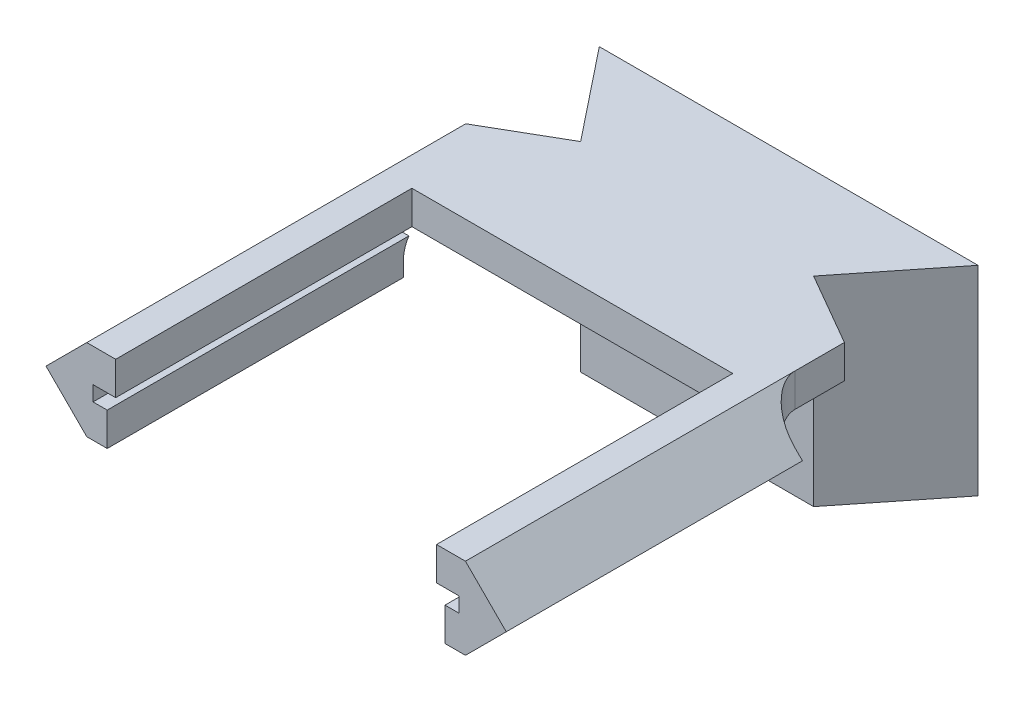
ISO-10303-21;
HEADER;
FILE_DESCRIPTION(('STEP AP214'),'2;1');
FILE_NAME('part.step','',(''),(''),'','','');
FILE_SCHEMA(('AUTOMOTIVE_DESIGN { 1 0 10303 214 1 1 1 1 }'));
ENDSEC;
DATA;
#1=APPLICATION_CONTEXT('core data for automotive mechanical design processes');
#2=APPLICATION_PROTOCOL_DEFINITION('international standard','automotive_design',2000,#1);
#3=PRODUCT_CONTEXT('',#1,'mechanical');
#4=PRODUCT('Part','Part','',(#3));
#5=PRODUCT_RELATED_PRODUCT_CATEGORY('part','',(#4));
#6=PRODUCT_DEFINITION_FORMATION('','',#4);
#7=PRODUCT_DEFINITION_CONTEXT('part definition',#1,'design');
#8=PRODUCT_DEFINITION('design','',#6,#7);
#9=PRODUCT_DEFINITION_SHAPE('','',#8);
#10=(LENGTH_UNIT() NAMED_UNIT(*) SI_UNIT(.MILLI.,.METRE.));
#11=(NAMED_UNIT(*) PLANE_ANGLE_UNIT() SI_UNIT($,.RADIAN.));
#12=(NAMED_UNIT(*) SI_UNIT($,.STERADIAN.) SOLID_ANGLE_UNIT());
#13=UNCERTAINTY_MEASURE_WITH_UNIT(LENGTH_MEASURE(1.E-05),#10,'distance_accuracy_value','');
#14=(GEOMETRIC_REPRESENTATION_CONTEXT(3) GLOBAL_UNCERTAINTY_ASSIGNED_CONTEXT((#13)) GLOBAL_UNIT_ASSIGNED_CONTEXT((#10,
#11,#12)) REPRESENTATION_CONTEXT('',''));
#15=CARTESIAN_POINT('',(0.,0.,0.));
#16=DIRECTION('',(0.,0.,1.));
#17=DIRECTION('',(1.,0.,0.));
#18=AXIS2_PLACEMENT_3D('',#15,#16,#17);
#19=CARTESIAN_POINT('',(0.,1.143,22.606));
#20=DIRECTION('',(0.,-1.,0.));
#21=DIRECTION('',(0.,0.,-1.));
#22=AXIS2_PLACEMENT_3D('',#19,#20,#21);
#23=PLANE('',#22);
#24=DIRECTION('',(-0.866025403784442,0.,0.499999999999995));
#25=VECTOR('',#24,1.);
#26=CARTESIAN_POINT('',(-2.99732098552339,1.143,-5.19151223351899));
#27=LINE('',#26,#25);
#28=CARTESIAN_POINT('',(4.5085,1.143,-9.525));
#29=VERTEX_POINT('',#28);
#30=CARTESIAN_POINT('',(-1.05210244842766,1.143,-6.31458467954385));
#31=VERTEX_POINT('',#30);
#32=EDGE_CURVE('E50',#29,#31,#27,.T.);
#33=ORIENTED_EDGE('',*,*,#32,.F.);
#34=DIRECTION('',(-1.,0.,0.));
#35=VECTOR('',#34,1.);
#36=CARTESIAN_POINT('',(4.5085,1.143,-9.525));
#37=LINE('',#36,#35);
#38=CARTESIAN_POINT('',(22.2885,1.143,-9.525));
#39=VERTEX_POINT('',#38);
#40=EDGE_CURVE('E259',#39,#29,#37,.T.);
#41=ORIENTED_EDGE('',*,*,#40,.F.);
#42=DIRECTION('',(0.866025403784442,0.,0.499999999999995));
#43=VECTOR('',#42,1.);
#44=CARTESIAN_POINT('',(9.69657098552326,1.143,-16.7949536061247));
#45=LINE('',#44,#43);
#46=CARTESIAN_POINT('',(27.8491024484277,1.143,-6.31458467954384));
#47=VERTEX_POINT('',#46);
#48=EDGE_CURVE('E265',#39,#47,#45,.T.);
#49=ORIENTED_EDGE('',*,*,#48,.T.);
#50=DIRECTION('',(0.,0.,-1.));
#51=VECTOR('',#50,1.);
#52=CARTESIAN_POINT('',(27.8491024484277,1.143,4.75232913948519));
#53=LINE('',#52,#51);
#54=CARTESIAN_POINT('',(27.8491024484277,1.143,-2.54));
#55=VERTEX_POINT('',#54);
#56=EDGE_CURVE('E292',#55,#47,#53,.T.);
#57=ORIENTED_EDGE('',*,*,#56,.F.);
#58=DIRECTION('',(-1.,0.,0.));
#59=VECTOR('',#58,1.);
#60=CARTESIAN_POINT('',(27.3685,1.143,-2.54));
#61=LINE('',#60,#59);
#62=CARTESIAN_POINT('',(27.3685,1.143,-2.53999999999999));
#63=VERTEX_POINT('',#62);
#64=EDGE_CURVE('E423',#55,#63,#61,.T.);
#65=ORIENTED_EDGE('',*,*,#64,.T.);
#66=DIRECTION('',(0.,0.,-1.));
#67=VECTOR('',#66,1.);
#68=CARTESIAN_POINT('',(27.3685,1.143,22.606));
#69=LINE('',#68,#67);
#70=CARTESIAN_POINT('',(27.3685,1.143,22.606));
#71=VERTEX_POINT('',#70);
#72=EDGE_CURVE('E374',#71,#63,#69,.T.);
#73=ORIENTED_EDGE('',*,*,#72,.F.);
#74=DIRECTION('',(-1.,0.,0.));
#75=VECTOR('',#74,1.);
#76=CARTESIAN_POINT('',(26.797,1.143,22.606));
#77=LINE('',#76,#75);
#78=CARTESIAN_POINT('',(25.6413,1.143,22.606));
#79=VERTEX_POINT('',#78);
#80=EDGE_CURVE('E365',#71,#79,#77,.T.);
#81=ORIENTED_EDGE('',*,*,#80,.T.);
#82=DIRECTION('',(0.,0.,-1.));
#83=VECTOR('',#82,1.);
#84=CARTESIAN_POINT('',(25.6413,1.143,22.606));
#85=LINE('',#84,#83);
#86=CARTESIAN_POINT('',(25.6413,1.143,0.));
#87=VERTEX_POINT('',#86);
#88=EDGE_CURVE('E314',#79,#87,#85,.T.);
#89=ORIENTED_EDGE('',*,*,#88,.T.);
#90=DIRECTION('',(-1.,0.,0.));
#91=VECTOR('',#90,1.);
#92=CARTESIAN_POINT('',(25.6413,1.143,0.));
#93=LINE('',#92,#91);
#94=CARTESIAN_POINT('',(1.1557,1.143,0.));
#95=VERTEX_POINT('',#94);
#96=EDGE_CURVE('E318',#87,#95,#93,.T.);
#97=ORIENTED_EDGE('',*,*,#96,.T.);
#98=DIRECTION('',(0.,0.,1.));
#99=VECTOR('',#98,1.);
#100=CARTESIAN_POINT('',(1.1557,1.143,0.));
#101=LINE('',#100,#99);
#102=CARTESIAN_POINT('',(1.1557,1.143,22.606));
#103=VERTEX_POINT('',#102);
#104=EDGE_CURVE('E311',#95,#103,#101,.T.);
#105=ORIENTED_EDGE('',*,*,#104,.T.);
#106=CARTESIAN_POINT('',(-0.571500000000003,1.143,22.606));
#107=VERTEX_POINT('',#106);
#108=EDGE_CURVE('E364',#103,#107,#77,.T.);
#109=ORIENTED_EDGE('',*,*,#108,.T.);
#110=DIRECTION('',(0.,0.,-1.));
#111=VECTOR('',#110,1.);
#112=CARTESIAN_POINT('',(-0.571500000000003,1.143,22.606));
#113=LINE('',#112,#111);
#114=CARTESIAN_POINT('',(-0.571500000000003,1.143,-2.53999999999999));
#115=VERTEX_POINT('',#114);
#116=EDGE_CURVE('E372',#107,#115,#113,.T.);
#117=ORIENTED_EDGE('',*,*,#116,.T.);
#118=DIRECTION('',(-1.,0.,0.));
#119=VECTOR('',#118,1.);
#120=CARTESIAN_POINT('',(-1.05210244842766,1.143,-2.54));
#121=LINE('',#120,#119);
#122=CARTESIAN_POINT('',(-1.05210244842766,1.143,-2.54));
#123=VERTEX_POINT('',#122);
#124=EDGE_CURVE('E426',#115,#123,#121,.T.);
#125=ORIENTED_EDGE('',*,*,#124,.T.);
#126=DIRECTION('',(0.,0.,-1.));
#127=VECTOR('',#126,1.);
#128=CARTESIAN_POINT('',(-1.05210244842766,1.143,4.75232913948519));
#129=LINE('',#128,#127);
#130=EDGE_CURVE('E302',#123,#31,#129,.T.);
#131=ORIENTED_EDGE('',*,*,#130,.T.);
#132=EDGE_LOOP('',(#33,#41,#49,#57,#65,#73,#81,#89,#97,#105,#109,#117,#125,#131));
#133=FACE_BOUND('',#132,.T.);
#134=ADVANCED_FACE('F33',(#133),#23,.T.);
#135=CARTESIAN_POINT('',(0.825499999999998,3.683,22.606));
#136=DIRECTION('',(0.,-1.,0.));
#137=DIRECTION('',(1.,0.,0.));
#138=AXIS2_PLACEMENT_3D('',#135,#136,#137);
#139=PLANE('',#138);
#140=DIRECTION('',(1.,0.,0.));
#141=VECTOR('',#140,1.);
#142=CARTESIAN_POINT('',(-1.05210244842766,3.683,-16.51));
#143=LINE('',#142,#141);
#144=CARTESIAN_POINT('',(-1.05210244842766,3.683,-16.51));
#145=VERTEX_POINT('',#144);
#146=CARTESIAN_POINT('',(27.8491024484277,3.68300000000001,-16.51));
#147=VERTEX_POINT('',#146);
#148=EDGE_CURVE('E330',#145,#147,#143,.T.);
#149=ORIENTED_EDGE('',*,*,#148,.F.);
#150=DIRECTION('',(-0.622822097726502,0.,-0.782363492619358));
#151=VECTOR('',#150,1.);
#152=CARTESIAN_POINT('',(7.40089755556073,3.683,-5.89168920086087));
#153=LINE('',#152,#151);
#154=CARTESIAN_POINT('',(4.5085,3.683,-9.525));
#155=VERTEX_POINT('',#154);
#156=EDGE_CURVE('E272',#155,#145,#153,.T.);
#157=ORIENTED_EDGE('',*,*,#156,.F.);
#158=DIRECTION('',(0.866025403784442,0.,-0.499999999999995));
#159=VECTOR('',#158,1.);
#160=CARTESIAN_POINT('',(-2.99732098552338,3.683,-5.191512233519));
#161=LINE('',#160,#159);
#162=CARTESIAN_POINT('',(-1.05210244842766,3.683,-6.31458467954385));
#163=VERTEX_POINT('',#162);
#164=EDGE_CURVE('E274',#163,#155,#161,.T.);
#165=ORIENTED_EDGE('',*,*,#164,.F.);
#166=DIRECTION('',(0.,0.,-1.));
#167=VECTOR('',#166,1.);
#168=CARTESIAN_POINT('',(-1.05210244842766,3.683,4.75232913948519));
#169=LINE('',#168,#167);
#170=CARTESIAN_POINT('',(-1.05210244842766,3.683,-2.53999999999999));
#171=VERTEX_POINT('',#170);
#172=EDGE_CURVE('E305',#171,#163,#169,.T.);
#173=ORIENTED_EDGE('',*,*,#172,.F.);
#174=DIRECTION('',(0.,0.,-1.));
#175=VECTOR('',#174,1.);
#176=CARTESIAN_POINT('',(-1.05210244842766,3.683,22.606));
#177=LINE('',#176,#175);
#178=CARTESIAN_POINT('',(-1.05210244842766,3.683,22.606));
#179=VERTEX_POINT('',#178);
#180=EDGE_CURVE('E410',#179,#171,#177,.T.);
#181=ORIENTED_EDGE('',*,*,#180,.F.);
#182=DIRECTION('',(-1.,0.,0.));
#183=VECTOR('',#182,1.);
#184=CARTESIAN_POINT('',(25.9715,3.683,22.606));
#185=LINE('',#184,#183);
#186=CARTESIAN_POINT('',(1.1557,3.683,22.606));
#187=VERTEX_POINT('',#186);
#188=EDGE_CURVE('E391',#187,#179,#185,.T.);
#189=ORIENTED_EDGE('',*,*,#188,.F.);
#190=DIRECTION('',(0.,0.,1.));
#191=VECTOR('',#190,1.);
#192=CARTESIAN_POINT('',(1.1557,3.683,0.));
#193=LINE('',#192,#191);
#194=CARTESIAN_POINT('',(1.1557,3.683,0.));
#195=VERTEX_POINT('',#194);
#196=EDGE_CURVE('E300',#195,#187,#193,.T.);
#197=ORIENTED_EDGE('',*,*,#196,.F.);
#198=DIRECTION('',(-1.,0.,0.));
#199=VECTOR('',#198,1.);
#200=CARTESIAN_POINT('',(2.9845,3.683,0.));
#201=LINE('',#200,#199);
#202=CARTESIAN_POINT('',(25.6413,3.683,0.));
#203=VERTEX_POINT('',#202);
#204=EDGE_CURVE('E315',#203,#195,#201,.T.);
#205=ORIENTED_EDGE('',*,*,#204,.F.);
#206=DIRECTION('',(0.,0.,-1.));
#207=VECTOR('',#206,1.);
#208=CARTESIAN_POINT('',(25.6413,3.683,22.606));
#209=LINE('',#208,#207);
#210=CARTESIAN_POINT('',(25.6413,3.683,22.606));
#211=VERTEX_POINT('',#210);
#212=EDGE_CURVE('E323',#211,#203,#209,.T.);
#213=ORIENTED_EDGE('',*,*,#212,.F.);
#214=CARTESIAN_POINT('',(27.8491024484277,3.683,22.606));
#215=VERTEX_POINT('',#214);
#216=EDGE_CURVE('E392',#215,#211,#185,.T.);
#217=ORIENTED_EDGE('',*,*,#216,.F.);
#218=DIRECTION('',(0.,0.,-1.));
#219=VECTOR('',#218,1.);
#220=CARTESIAN_POINT('',(27.8491024484277,3.683,22.606));
#221=LINE('',#220,#219);
#222=CARTESIAN_POINT('',(27.8491024484277,3.683,-2.54));
#223=VERTEX_POINT('',#222);
#224=EDGE_CURVE('E412',#215,#223,#221,.T.);
#225=ORIENTED_EDGE('',*,*,#224,.T.);
#226=DIRECTION('',(0.,0.,-1.));
#227=VECTOR('',#226,1.);
#228=CARTESIAN_POINT('',(27.8491024484277,3.683,4.75232913948519));
#229=LINE('',#228,#227);
#230=CARTESIAN_POINT('',(27.8491024484277,3.683,-6.31458467954384));
#231=VERTEX_POINT('',#230);
#232=EDGE_CURVE('E290',#223,#231,#229,.T.);
#233=ORIENTED_EDGE('',*,*,#232,.T.);
#234=DIRECTION('',(-0.866025403784442,0.,-0.499999999999995));
#235=VECTOR('',#234,1.);
#236=CARTESIAN_POINT('',(9.69657098552326,3.683,-16.7949536061247));
#237=LINE('',#236,#235);
#238=CARTESIAN_POINT('',(22.2885,3.68300000000001,-9.525));
#239=VERTEX_POINT('',#238);
#240=EDGE_CURVE('E58',#231,#239,#237,.T.);
#241=ORIENTED_EDGE('',*,*,#240,.T.);
#242=DIRECTION('',(0.622822097726502,0.,-0.782363492619358));
#243=VECTOR('',#242,1.);
#244=CARTESIAN_POINT('',(9.00134877337494,3.683,7.16577265975375));
#245=LINE('',#244,#243);
#246=EDGE_CURVE('E281',#239,#147,#245,.T.);
#247=ORIENTED_EDGE('',*,*,#246,.T.);
#248=EDGE_LOOP('',(#149,#157,#165,#173,#181,#189,#197,#205,#213,#217,#225,#233,#241,#247));
#249=FACE_BOUND('',#248,.T.);
#250=ADVANCED_FACE('F531',(#249),#139,.F.);
#251=CARTESIAN_POINT('',(27.8491024484277,1.143,4.75232913948519));
#252=DIRECTION('',(-1.,0.,0.));
#253=DIRECTION('',(0.,-1.,0.));
#254=AXIS2_PLACEMENT_3D('',#251,#252,#253);
#255=PLANE('',#254);
#256=DIRECTION('',(0.,-1.,0.));
#257=VECTOR('',#256,1.);
#258=CARTESIAN_POINT('',(27.8491024484277,15.2962163135822,-6.31458467954384));
#259=LINE('',#258,#257);
#260=EDGE_CURVE('E283',#231,#47,#259,.T.);
#261=ORIENTED_EDGE('',*,*,#260,.F.);
#262=ORIENTED_EDGE('',*,*,#232,.F.);
#263=DIRECTION('',(0.,-1.,0.));
#264=VECTOR('',#263,1.);
#265=CARTESIAN_POINT('',(27.8491024484277,1.143,-2.54));
#266=LINE('',#265,#264);
#267=EDGE_CURVE('E440',#223,#55,#266,.T.);
#268=ORIENTED_EDGE('',*,*,#267,.T.);
#269=ORIENTED_EDGE('',*,*,#56,.T.);
#270=EDGE_LOOP('',(#261,#262,#268,#269));
#271=FACE_BOUND('',#270,.T.);
#272=ADVANCED_FACE('F525',(#271),#255,.F.);
#273=CARTESIAN_POINT('',(0.,0.,0.));
#274=DIRECTION('',(0.,0.,-1.));
#275=DIRECTION('',(-1.,0.,0.));
#276=AXIS2_PLACEMENT_3D('',#273,#274,#275);
#277=PLANE('',#276);
#278=DIRECTION('',(0.,1.,0.));
#279=VECTOR('',#278,1.);
#280=CARTESIAN_POINT('',(26.289,0.,0.));
#281=LINE('',#280,#279);
#282=CARTESIAN_POINT('',(26.289,-2.54,0.));
#283=VERTEX_POINT('',#282);
#284=CARTESIAN_POINT('',(26.289,-1.397,0.));
#285=VERTEX_POINT('',#284);
#286=EDGE_CURVE('E342',#283,#285,#281,.T.);
#287=ORIENTED_EDGE('',*,*,#286,.T.);
#288=DIRECTION('',(-1.,0.,0.));
#289=VECTOR('',#288,1.);
#290=CARTESIAN_POINT('',(27.8491024484277,-1.397,0.));
#291=LINE('',#290,#289);
#292=CARTESIAN_POINT('',(28.9921024484277,-1.397,0.));
#293=VERTEX_POINT('',#292);
#294=EDGE_CURVE('E438',#285,#293,#291,.F.);
#295=ORIENTED_EDGE('',*,*,#294,.T.);
#296=DIRECTION('',(0.707106781186547,0.707106781186548,0.));
#297=VECTOR('',#296,1.);
#298=CARTESIAN_POINT('',(27.8491024484277,-2.54,0.));
#299=LINE('',#298,#297);
#300=CARTESIAN_POINT('',(27.8491024484277,-2.54,0.));
#301=VERTEX_POINT('',#300);
#302=EDGE_CURVE('E383',#301,#293,#299,.T.);
#303=ORIENTED_EDGE('',*,*,#302,.F.);
#304=DIRECTION('',(1.,0.,0.));
#305=VECTOR('',#304,1.);
#306=CARTESIAN_POINT('',(25.9715,-2.54,0.));
#307=LINE('',#306,#305);
#308=EDGE_CURVE('E401',#283,#301,#307,.T.);
#309=ORIENTED_EDGE('',*,*,#308,.F.);
#310=EDGE_LOOP('',(#287,#295,#303,#309));
#311=FACE_BOUND('',#310,.T.);
#312=ADVANCED_FACE('F509',(#311),#277,.T.);
#313=DIRECTION('',(0.707106781186548,-0.707106781186547,0.));
#314=VECTOR('',#313,1.);
#315=CARTESIAN_POINT('',(-1.05210244842766,-2.54,0.));
#316=LINE('',#315,#314);
#317=CARTESIAN_POINT('',(-2.19510244842766,-1.397,0.));
#318=VERTEX_POINT('',#317);
#319=CARTESIAN_POINT('',(-1.05210244842766,-2.54,0.));
#320=VERTEX_POINT('',#319);
#321=EDGE_CURVE('E378',#318,#320,#316,.T.);
#322=ORIENTED_EDGE('',*,*,#321,.F.);
#323=DIRECTION('',(-1.,0.,0.));
#324=VECTOR('',#323,1.);
#325=CARTESIAN_POINT('',(-0.571500000000003,-1.397,0.));
#326=LINE('',#325,#324);
#327=CARTESIAN_POINT('',(0.507999999999999,-1.397,0.));
#328=VERTEX_POINT('',#327);
#329=EDGE_CURVE('E431',#318,#328,#326,.F.);
#330=ORIENTED_EDGE('',*,*,#329,.T.);
#331=DIRECTION('',(0.,-1.,0.));
#332=VECTOR('',#331,1.);
#333=CARTESIAN_POINT('',(0.508,0.,0.));
#334=LINE('',#333,#332);
#335=CARTESIAN_POINT('',(0.507999999999998,-2.54,0.));
#336=VERTEX_POINT('',#335);
#337=EDGE_CURVE('E340',#328,#336,#334,.T.);
#338=ORIENTED_EDGE('',*,*,#337,.T.);
#339=EDGE_CURVE('E402',#320,#336,#307,.T.);
#340=ORIENTED_EDGE('',*,*,#339,.F.);
#341=EDGE_LOOP('',(#322,#330,#338,#340));
#342=FACE_BOUND('',#341,.T.);
#343=ADVANCED_FACE('F630',(#342),#277,.T.);
#344=CARTESIAN_POINT('',(30.9606024484277,0.571499999999999,22.606));
#345=DIRECTION('',(-0.707106781186548,-0.707106781186547,0.));
#346=DIRECTION('',(0.707106781186547,-0.707106781186548,0.));
#347=AXIS2_PLACEMENT_3D('',#344,#345,#346);
#348=PLANE('',#347);
#349=DIRECTION('',(-0.707106781186547,0.707106781186548,0.));
#350=VECTOR('',#349,1.);
#351=CARTESIAN_POINT('',(27.8491024484277,3.683,0.));
#352=LINE('',#351,#350);
#353=CARTESIAN_POINT('',(30.9606024484277,0.571499999999999,0.));
#354=VERTEX_POINT('',#353);
#355=CARTESIAN_POINT('',(30.3891024484277,1.143,0.));
#356=VERTEX_POINT('',#355);
#357=EDGE_CURVE('E295',#354,#356,#352,.T.);
#358=ORIENTED_EDGE('',*,*,#357,.T.);
#359=CARTESIAN_POINT('',(30.3891024484277,1.143,-2.54));
#360=DIRECTION('',(-0.707106781186548,-0.707106781186547,0.));
#361=DIRECTION('',(0.707106781186547,-0.707106781186548,0.));
#362=AXIS2_PLACEMENT_3D('',#359,#360,#361);
#363=ELLIPSE('',#362,3.59210244842766,2.54);
#364=EDGE_CURVE('E12',#356,#223,#363,.T.);
#365=ORIENTED_EDGE('',*,*,#364,.T.);
#366=ORIENTED_EDGE('',*,*,#224,.F.);
#367=DIRECTION('',(-0.707106781186547,0.707106781186548,0.));
#368=VECTOR('',#367,1.);
#369=CARTESIAN_POINT('',(30.9606024484277,0.571499999999999,22.606));
#370=LINE('',#369,#368);
#371=CARTESIAN_POINT('',(30.9606024484277,0.571499999999999,22.606));
#372=VERTEX_POINT('',#371);
#373=EDGE_CURVE('E389',#372,#215,#370,.T.);
#374=ORIENTED_EDGE('',*,*,#373,.F.);
#375=DIRECTION('',(0.,0.,-1.));
#376=VECTOR('',#375,1.);
#377=CARTESIAN_POINT('',(30.9606024484277,0.571499999999999,22.606));
#378=LINE('',#377,#376);
#379=EDGE_CURVE('E414',#372,#354,#378,.T.);
#380=ORIENTED_EDGE('',*,*,#379,.T.);
#381=EDGE_LOOP('',(#358,#365,#366,#374,#380));
#382=FACE_BOUND('',#381,.T.);
#383=ADVANCED_FACE('F494',(#382),#348,.F.);
#384=CARTESIAN_POINT('',(-4.16360244842766,0.571499999999995,22.606));
#385=DIRECTION('',(0.707106781186548,-0.707106781186547,0.));
#386=DIRECTION('',(0.707106781186547,0.707106781186548,0.));
#387=AXIS2_PLACEMENT_3D('',#384,#385,#386);
#388=PLANE('',#387);
#389=ORIENTED_EDGE('',*,*,#180,.T.);
#390=CARTESIAN_POINT('',(-3.59210244842766,1.143,-2.54));
#391=DIRECTION('',(0.707106781186548,-0.707106781186547,0.));
#392=DIRECTION('',(0.707106781186547,0.707106781186548,0.));
#393=AXIS2_PLACEMENT_3D('',#390,#391,#392);
#394=ELLIPSE('',#393,3.59210244842766,2.54);
#395=CARTESIAN_POINT('',(-3.59210244842766,1.14300000000001,0.));
#396=VERTEX_POINT('',#395);
#397=EDGE_CURVE('E453',#171,#396,#394,.T.);
#398=ORIENTED_EDGE('',*,*,#397,.T.);
#399=DIRECTION('',(-0.707106781186548,-0.707106781186547,0.));
#400=VECTOR('',#399,1.);
#401=CARTESIAN_POINT('',(-1.05210244842766,3.683,0.));
#402=LINE('',#401,#400);
#403=CARTESIAN_POINT('',(-4.16360244842766,0.571499999999999,0.));
#404=VERTEX_POINT('',#403);
#405=EDGE_CURVE('E291',#396,#404,#402,.T.);
#406=ORIENTED_EDGE('',*,*,#405,.T.);
#407=DIRECTION('',(0.,0.,-1.));
#408=VECTOR('',#407,1.);
#409=CARTESIAN_POINT('',(-4.16360244842766,0.571499999999995,22.606));
#410=LINE('',#409,#408);
#411=CARTESIAN_POINT('',(-4.16360244842766,0.571499999999995,22.606));
#412=VERTEX_POINT('',#411);
#413=EDGE_CURVE('E397',#412,#404,#410,.T.);
#414=ORIENTED_EDGE('',*,*,#413,.F.);
#415=DIRECTION('',(-0.707106781186547,-0.707106781186548,0.));
#416=VECTOR('',#415,1.);
#417=CARTESIAN_POINT('',(-4.16360244842766,0.571499999999995,22.606));
#418=LINE('',#417,#416);
#419=EDGE_CURVE('E395',#179,#412,#418,.T.);
#420=ORIENTED_EDGE('',*,*,#419,.F.);
#421=EDGE_LOOP('',(#389,#398,#406,#414,#420));
#422=FACE_BOUND('',#421,.T.);
#423=ADVANCED_FACE('F616',(#422),#388,.F.);
#424=CARTESIAN_POINT('',(27.3685,1.143,22.606));
#425=DIRECTION('',(-1.,0.,0.));
#426=DIRECTION('',(0.,0.,1.));
#427=AXIS2_PLACEMENT_3D('',#424,#425,#426);
#428=PLANE('',#427);
#429=ORIENTED_EDGE('',*,*,#72,.T.);
#430=CARTESIAN_POINT('',(27.3685,-1.397,-2.54));
#431=DIRECTION('',(-1.,0.,0.));
#432=DIRECTION('',(0.,0.,1.));
#433=AXIS2_PLACEMENT_3D('',#430,#431,#432);
#434=CIRCLE('',#433,2.54);
#435=CARTESIAN_POINT('',(27.3685,0.,-0.418681777761751));
#436=VERTEX_POINT('',#435);
#437=EDGE_CURVE('E457',#63,#436,#434,.F.);
#438=ORIENTED_EDGE('',*,*,#437,.T.);
#439=DIRECTION('',(0.,0.,-1.));
#440=VECTOR('',#439,1.);
#441=CARTESIAN_POINT('',(27.3685,0.,22.606));
#442=LINE('',#441,#440);
#443=CARTESIAN_POINT('',(27.3685,0.,22.606));
#444=VERTEX_POINT('',#443);
#445=EDGE_CURVE('E376',#444,#436,#442,.T.);
#446=ORIENTED_EDGE('',*,*,#445,.F.);
#447=DIRECTION('',(0.,1.,0.));
#448=VECTOR('',#447,1.);
#449=CARTESIAN_POINT('',(27.3685,1.143,22.606));
#450=LINE('',#449,#448);
#451=EDGE_CURVE('E362',#444,#71,#450,.T.);
#452=ORIENTED_EDGE('',*,*,#451,.T.);
#453=EDGE_LOOP('',(#429,#438,#446,#452));
#454=FACE_BOUND('',#453,.T.);
#455=ADVANCED_FACE('F519',(#454),#428,.T.);
#456=CARTESIAN_POINT('',(-0.571500000000003,1.143,22.606));
#457=DIRECTION('',(1.,0.,0.));
#458=DIRECTION('',(0.,0.,-1.));
#459=AXIS2_PLACEMENT_3D('',#456,#457,#458);
#460=PLANE('',#459);
#461=DIRECTION('',(0.,0.,-1.));
#462=VECTOR('',#461,1.);
#463=CARTESIAN_POINT('',(-0.571500000000003,0.,22.606));
#464=LINE('',#463,#462);
#465=CARTESIAN_POINT('',(-0.571500000000003,0.,22.606));
#466=VERTEX_POINT('',#465);
#467=CARTESIAN_POINT('',(-0.571500000000003,0.,-0.418681777761751));
#468=VERTEX_POINT('',#467);
#469=EDGE_CURVE('E370',#466,#468,#464,.T.);
#470=ORIENTED_EDGE('',*,*,#469,.T.);
#471=CARTESIAN_POINT('',(-0.571500000000003,-1.397,-2.54));
#472=DIRECTION('',(1.,0.,0.));
#473=DIRECTION('',(0.,0.,-1.));
#474=AXIS2_PLACEMENT_3D('',#471,#472,#473);
#475=CIRCLE('',#474,2.54);
#476=EDGE_CURVE('E450',#468,#115,#475,.F.);
#477=ORIENTED_EDGE('',*,*,#476,.T.);
#478=ORIENTED_EDGE('',*,*,#116,.F.);
#479=DIRECTION('',(0.,-1.,0.));
#480=VECTOR('',#479,1.);
#481=CARTESIAN_POINT('',(-0.571500000000003,1.143,22.606));
#482=LINE('',#481,#480);
#483=EDGE_CURVE('E368',#107,#466,#482,.T.);
#484=ORIENTED_EDGE('',*,*,#483,.T.);
#485=EDGE_LOOP('',(#470,#477,#478,#484));
#486=FACE_BOUND('',#485,.T.);
#487=ADVANCED_FACE('F553',(#486),#460,.T.);
#488=CARTESIAN_POINT('',(0.,0.,22.606));
#489=DIRECTION('',(0.,0.,-1.));
#490=DIRECTION('',(-1.,0.,0.));
#491=AXIS2_PLACEMENT_3D('',#488,#489,#490);
#492=PLANE('',#491);
#493=ORIENTED_EDGE('',*,*,#108,.F.);
#494=DIRECTION('',(0.,1.,0.));
#495=VECTOR('',#494,1.);
#496=CARTESIAN_POINT('',(1.1557,1.143,22.606));
#497=LINE('',#496,#495);
#498=EDGE_CURVE('E321',#103,#187,#497,.T.);
#499=ORIENTED_EDGE('',*,*,#498,.T.);
#500=ORIENTED_EDGE('',*,*,#188,.T.);
#501=ORIENTED_EDGE('',*,*,#419,.T.);
#502=DIRECTION('',(0.707106781186548,-0.707106781186547,0.));
#503=VECTOR('',#502,1.);
#504=CARTESIAN_POINT('',(-1.05210244842766,-2.54,22.606));
#505=LINE('',#504,#503);
#506=CARTESIAN_POINT('',(-1.05210244842766,-2.54,22.606));
#507=VERTEX_POINT('',#506);
#508=EDGE_CURVE('E379',#412,#507,#505,.T.);
#509=ORIENTED_EDGE('',*,*,#508,.T.);
#510=DIRECTION('',(1.,0.,0.));
#511=VECTOR('',#510,1.);
#512=CARTESIAN_POINT('',(0.825500000000002,-2.54,22.606));
#513=LINE('',#512,#511);
#514=CARTESIAN_POINT('',(0.507999999999998,-2.54,22.606));
#515=VERTEX_POINT('',#514);
#516=EDGE_CURVE('E384',#507,#515,#513,.T.);
#517=ORIENTED_EDGE('',*,*,#516,.T.);
#518=DIRECTION('',(0.,-1.,0.));
#519=VECTOR('',#518,1.);
#520=CARTESIAN_POINT('',(0.508,0.,22.606));
#521=LINE('',#520,#519);
#522=CARTESIAN_POINT('',(0.508,0.,22.606));
#523=VERTEX_POINT('',#522);
#524=EDGE_CURVE('E339',#523,#515,#521,.T.);
#525=ORIENTED_EDGE('',*,*,#524,.F.);
#526=DIRECTION('',(1.,0.,0.));
#527=VECTOR('',#526,1.);
#528=CARTESIAN_POINT('',(-0.571500000000003,0.,22.606));
#529=LINE('',#528,#527);
#530=EDGE_CURVE('E359',#466,#523,#529,.T.);
#531=ORIENTED_EDGE('',*,*,#530,.F.);
#532=ORIENTED_EDGE('',*,*,#483,.F.);
#533=EDGE_LOOP('',(#493,#499,#500,#501,#509,#517,#525,#531,#532));
#534=FACE_BOUND('',#533,.T.);
#535=ADVANCED_FACE('F547',(#534),#492,.F.);
#536=ORIENTED_EDGE('',*,*,#405,.F.);
#537=DIRECTION('',(0.,1.,0.));
#538=VECTOR('',#537,1.);
#539=CARTESIAN_POINT('',(-3.59210244842765,0.,0.));
#540=LINE('',#539,#538);
#541=CARTESIAN_POINT('',(-3.59210244842765,0.,0.));
#542=VERTEX_POINT('',#541);
#543=EDGE_CURVE('E429',#396,#542,#540,.F.);
#544=ORIENTED_EDGE('',*,*,#543,.T.);
#545=EDGE_CURVE('E398',#404,#542,#316,.T.);
#546=ORIENTED_EDGE('',*,*,#545,.F.);
#547=EDGE_LOOP('',(#536,#544,#546));
#548=FACE_BOUND('',#547,.T.);
#549=ADVANCED_FACE('F624',(#548),#277,.T.);
#550=CARTESIAN_POINT('',(25.9715,-2.54,22.606));
#551=DIRECTION('',(0.,1.,0.));
#552=DIRECTION('',(0.,0.,1.));
#553=AXIS2_PLACEMENT_3D('',#550,#551,#552);
#554=PLANE('',#553);
#555=ORIENTED_EDGE('',*,*,#339,.T.);
#556=DIRECTION('',(0.,0.,1.));
#557=VECTOR('',#556,1.);
#558=CARTESIAN_POINT('',(0.507999999999998,-2.54,0.));
#559=LINE('',#558,#557);
#560=EDGE_CURVE('E346',#336,#515,#559,.T.);
#561=ORIENTED_EDGE('',*,*,#560,.T.);
#562=ORIENTED_EDGE('',*,*,#516,.F.);
#563=DIRECTION('',(0.,0.,-1.));
#564=VECTOR('',#563,1.);
#565=CARTESIAN_POINT('',(-1.05210244842766,-2.54,22.606));
#566=LINE('',#565,#564);
#567=EDGE_CURVE('E420',#507,#320,#566,.T.);
#568=ORIENTED_EDGE('',*,*,#567,.T.);
#569=EDGE_LOOP('',(#555,#561,#562,#568));
#570=FACE_BOUND('',#569,.T.);
#571=ADVANCED_FACE('F635',(#570),#554,.F.);
#572=CARTESIAN_POINT('',(27.3685,0.,22.606));
#573=DIRECTION('',(0.,1.,0.));
#574=DIRECTION('',(0.,0.,1.));
#575=AXIS2_PLACEMENT_3D('',#572,#573,#574);
#576=PLANE('',#575);
#577=DIRECTION('',(0.,0.,1.));
#578=VECTOR('',#577,1.);
#579=CARTESIAN_POINT('',(0.508,0.,0.));
#580=LINE('',#579,#578);
#581=CARTESIAN_POINT('',(0.508,0.,-0.418681777761759));
#582=VERTEX_POINT('',#581);
#583=EDGE_CURVE('E349',#582,#523,#580,.T.);
#584=ORIENTED_EDGE('',*,*,#583,.F.);
#585=DIRECTION('',(1.,0.,0.));
#586=VECTOR('',#585,1.);
#587=CARTESIAN_POINT('',(0.508,0.,-0.418681777761759));
#588=LINE('',#587,#586);
#589=EDGE_CURVE('E447',#582,#468,#588,.F.);
#590=ORIENTED_EDGE('',*,*,#589,.T.);
#591=ORIENTED_EDGE('',*,*,#469,.F.);
#592=ORIENTED_EDGE('',*,*,#530,.T.);
#593=EDGE_LOOP('',(#584,#590,#591,#592));
#594=FACE_BOUND('',#593,.T.);
#595=ADVANCED_FACE('F555',(#594),#576,.T.);
#596=ORIENTED_EDGE('',*,*,#216,.T.);
#597=DIRECTION('',(0.,1.,0.));
#598=VECTOR('',#597,1.);
#599=CARTESIAN_POINT('',(25.6413,1.143,22.606));
#600=LINE('',#599,#598);
#601=EDGE_CURVE('E333',#79,#211,#600,.T.);
#602=ORIENTED_EDGE('',*,*,#601,.F.);
#603=ORIENTED_EDGE('',*,*,#80,.F.);
#604=ORIENTED_EDGE('',*,*,#451,.F.);
#605=CARTESIAN_POINT('',(26.289,0.,22.606));
#606=VERTEX_POINT('',#605);
#607=EDGE_CURVE('E351',#606,#444,#529,.T.);
#608=ORIENTED_EDGE('',*,*,#607,.F.);
#609=DIRECTION('',(0.,1.,0.));
#610=VECTOR('',#609,1.);
#611=CARTESIAN_POINT('',(26.289,0.,22.606));
#612=LINE('',#611,#610);
#613=CARTESIAN_POINT('',(26.289,-2.54,22.606));
#614=VERTEX_POINT('',#613);
#615=EDGE_CURVE('E343',#614,#606,#612,.T.);
#616=ORIENTED_EDGE('',*,*,#615,.F.);
#617=CARTESIAN_POINT('',(27.8491024484277,-2.54,22.606));
#618=VERTEX_POINT('',#617);
#619=EDGE_CURVE('E382',#614,#618,#513,.T.);
#620=ORIENTED_EDGE('',*,*,#619,.T.);
#621=DIRECTION('',(0.707106781186547,0.707106781186548,0.));
#622=VECTOR('',#621,1.);
#623=CARTESIAN_POINT('',(27.8491024484277,-2.54,22.606));
#624=LINE('',#623,#622);
#625=EDGE_CURVE('E387',#618,#372,#624,.T.);
#626=ORIENTED_EDGE('',*,*,#625,.T.);
#627=ORIENTED_EDGE('',*,*,#373,.T.);
#628=EDGE_LOOP('',(#596,#602,#603,#604,#608,#616,#620,#626,#627));
#629=FACE_BOUND('',#628,.T.);
#630=ADVANCED_FACE('F500',(#629),#492,.F.);
#631=CARTESIAN_POINT('',(30.3891024484277,0.,0.));
#632=VERTEX_POINT('',#631);
#633=EDGE_CURVE('E405',#632,#354,#299,.T.);
#634=ORIENTED_EDGE('',*,*,#633,.F.);
#635=DIRECTION('',(0.,-1.,0.));
#636=VECTOR('',#635,1.);
#637=CARTESIAN_POINT('',(30.3891024484277,0.,0.));
#638=LINE('',#637,#636);
#639=EDGE_CURVE('E436',#632,#356,#638,.F.);
#640=ORIENTED_EDGE('',*,*,#639,.T.);
#641=ORIENTED_EDGE('',*,*,#357,.F.);
#642=EDGE_LOOP('',(#634,#640,#641));
#643=FACE_BOUND('',#642,.T.);
#644=ADVANCED_FACE('F491',(#643),#277,.T.);
#645=CARTESIAN_POINT('',(-1.05210244842766,-2.54,22.606));
#646=DIRECTION('',(0.707106781186547,0.707106781186548,0.));
#647=DIRECTION('',(-0.707106781186548,0.707106781186547,0.));
#648=AXIS2_PLACEMENT_3D('',#645,#646,#647);
#649=PLANE('',#648);
#650=ORIENTED_EDGE('',*,*,#545,.T.);
#651=CARTESIAN_POINT('',(-3.59210244842765,0.,-2.54));
#652=DIRECTION('',(0.707106781186547,0.707106781186548,0.));
#653=DIRECTION('',(-0.707106781186548,0.707106781186547,0.));
#654=AXIS2_PLACEMENT_3D('',#651,#652,#653);
#655=ELLIPSE('',#654,3.59210244842767,2.54);
#656=CARTESIAN_POINT('',(-2.89360244842766,-0.698500000000003,-0.0979316655752645));
#657=VERTEX_POINT('',#656);
#658=EDGE_CURVE('E455',#542,#657,#655,.T.);
#659=ORIENTED_EDGE('',*,*,#658,.T.);
#660=CARTESIAN_POINT('',(-2.19510244842766,-1.397,-2.54));
#661=DIRECTION('',(0.707106781186547,0.707106781186548,0.));
#662=DIRECTION('',(0.707106781186548,-0.707106781186547,0.));
#663=AXIS2_PLACEMENT_3D('',#660,#661,#662);
#664=ELLIPSE('',#663,3.59210244842766,2.54);
#665=EDGE_CURVE('E442',#657,#318,#664,.T.);
#666=ORIENTED_EDGE('',*,*,#665,.T.);
#667=ORIENTED_EDGE('',*,*,#321,.T.);
#668=ORIENTED_EDGE('',*,*,#567,.F.);
#669=ORIENTED_EDGE('',*,*,#508,.F.);
#670=ORIENTED_EDGE('',*,*,#413,.T.);
#671=EDGE_LOOP('',(#650,#659,#666,#667,#668,#669,#670));
#672=FACE_BOUND('',#671,.T.);
#673=ADVANCED_FACE('F623',(#672),#649,.F.);
#674=ORIENTED_EDGE('',*,*,#619,.F.);
#675=DIRECTION('',(0.,0.,1.));
#676=VECTOR('',#675,1.);
#677=CARTESIAN_POINT('',(26.289,-2.54,0.));
#678=LINE('',#677,#676);
#679=EDGE_CURVE('E355',#283,#614,#678,.T.);
#680=ORIENTED_EDGE('',*,*,#679,.F.);
#681=ORIENTED_EDGE('',*,*,#308,.T.);
#682=DIRECTION('',(0.,0.,-1.));
#683=VECTOR('',#682,1.);
#684=CARTESIAN_POINT('',(27.8491024484277,-2.54,22.606));
#685=LINE('',#684,#683);
#686=EDGE_CURVE('E417',#618,#301,#685,.T.);
#687=ORIENTED_EDGE('',*,*,#686,.F.);
#688=EDGE_LOOP('',(#674,#680,#681,#687));
#689=FACE_BOUND('',#688,.T.);
#690=ADVANCED_FACE('F506',(#689),#554,.F.);
#691=CARTESIAN_POINT('',(27.8491024484277,-2.54,22.606));
#692=DIRECTION('',(-0.707106781186548,0.707106781186547,0.));
#693=DIRECTION('',(-0.707106781186547,-0.707106781186548,0.));
#694=AXIS2_PLACEMENT_3D('',#691,#692,#693);
#695=PLANE('',#694);
#696=ORIENTED_EDGE('',*,*,#302,.T.);
#697=CARTESIAN_POINT('',(28.9921024484277,-1.397,-2.54));
#698=DIRECTION('',(-0.707106781186548,0.707106781186547,0.));
#699=DIRECTION('',(0.707106781186547,0.707106781186548,0.));
#700=AXIS2_PLACEMENT_3D('',#697,#698,#699);
#701=ELLIPSE('',#700,3.59210244842766,2.54);
#702=CARTESIAN_POINT('',(29.6906024484277,-0.698500000000004,-0.0979316655752641));
#703=VERTEX_POINT('',#702);
#704=EDGE_CURVE('E465',#293,#703,#701,.T.);
#705=ORIENTED_EDGE('',*,*,#704,.T.);
#706=CARTESIAN_POINT('',(30.3891024484277,0.,-2.54));
#707=DIRECTION('',(-0.707106781186548,0.707106781186547,0.));
#708=DIRECTION('',(-0.707106781186547,-0.707106781186548,0.));
#709=AXIS2_PLACEMENT_3D('',#706,#707,#708);
#710=ELLIPSE('',#709,3.59210244842767,2.54);
#711=EDGE_CURVE('E42',#703,#632,#710,.T.);
#712=ORIENTED_EDGE('',*,*,#711,.T.);
#713=ORIENTED_EDGE('',*,*,#633,.T.);
#714=ORIENTED_EDGE('',*,*,#379,.F.);
#715=ORIENTED_EDGE('',*,*,#625,.F.);
#716=ORIENTED_EDGE('',*,*,#686,.T.);
#717=EDGE_LOOP('',(#696,#705,#712,#713,#714,#715,#716));
#718=FACE_BOUND('',#717,.T.);
#719=ADVANCED_FACE('F487',(#718),#695,.F.);
#720=DIRECTION('',(0.,0.,1.));
#721=VECTOR('',#720,1.);
#722=CARTESIAN_POINT('',(26.289,0.,0.));
#723=LINE('',#722,#721);
#724=CARTESIAN_POINT('',(26.289,0.,-0.418681777761759));
#725=VERTEX_POINT('',#724);
#726=EDGE_CURVE('E352',#725,#606,#723,.T.);
#727=ORIENTED_EDGE('',*,*,#726,.T.);
#728=ORIENTED_EDGE('',*,*,#607,.T.);
#729=ORIENTED_EDGE('',*,*,#445,.T.);
#730=DIRECTION('',(1.,0.,0.));
#731=VECTOR('',#730,1.);
#732=CARTESIAN_POINT('',(27.3685,0.,-0.418681777761759));
#733=LINE('',#732,#731);
#734=EDGE_CURVE('E460',#436,#725,#733,.F.);
#735=ORIENTED_EDGE('',*,*,#734,.T.);
#736=EDGE_LOOP('',(#727,#728,#729,#735));
#737=FACE_BOUND('',#736,.T.);
#738=ADVANCED_FACE('F515',(#737),#576,.T.);
#739=CARTESIAN_POINT('',(26.289,0.,0.));
#740=DIRECTION('',(1.,0.,0.));
#741=DIRECTION('',(0.,0.,-1.));
#742=AXIS2_PLACEMENT_3D('',#739,#740,#741);
#743=PLANE('',#742);
#744=ORIENTED_EDGE('',*,*,#615,.T.);
#745=ORIENTED_EDGE('',*,*,#726,.F.);
#746=CARTESIAN_POINT('',(26.289,-1.397,-2.54));
#747=DIRECTION('',(1.,0.,0.));
#748=DIRECTION('',(0.,0.,-1.));
#749=AXIS2_PLACEMENT_3D('',#746,#747,#748);
#750=CIRCLE('',#749,2.54);
#751=EDGE_CURVE('E463',#725,#285,#750,.T.);
#752=ORIENTED_EDGE('',*,*,#751,.T.);
#753=ORIENTED_EDGE('',*,*,#286,.F.);
#754=ORIENTED_EDGE('',*,*,#679,.T.);
#755=EDGE_LOOP('',(#744,#745,#752,#753,#754));
#756=FACE_BOUND('',#755,.T.);
#757=ADVANCED_FACE('F513',(#756),#743,.F.);
#758=CARTESIAN_POINT('',(0.508,0.,0.));
#759=DIRECTION('',(-1.,0.,0.));
#760=DIRECTION('',(0.,-1.,0.));
#761=AXIS2_PLACEMENT_3D('',#758,#759,#760);
#762=PLANE('',#761);
#763=ORIENTED_EDGE('',*,*,#524,.T.);
#764=ORIENTED_EDGE('',*,*,#560,.F.);
#765=ORIENTED_EDGE('',*,*,#337,.F.);
#766=CARTESIAN_POINT('',(0.507999999999999,-1.397,-2.54));
#767=DIRECTION('',(-1.,0.,0.));
#768=DIRECTION('',(0.,-1.,0.));
#769=AXIS2_PLACEMENT_3D('',#766,#767,#768);
#770=CIRCLE('',#769,2.54);
#771=EDGE_CURVE('E444',#328,#582,#770,.T.);
#772=ORIENTED_EDGE('',*,*,#771,.T.);
#773=ORIENTED_EDGE('',*,*,#583,.T.);
#774=EDGE_LOOP('',(#763,#764,#765,#772,#773));
#775=FACE_BOUND('',#774,.T.);
#776=ADVANCED_FACE('F695',(#775),#762,.F.);
#777=CARTESIAN_POINT('',(0.,0.,-16.51));
#778=DIRECTION('',(0.,0.,1.));
#779=DIRECTION('',(1.,0.,0.));
#780=AXIS2_PLACEMENT_3D('',#777,#778,#779);
#781=PLANE('',#780);
#782=CARTESIAN_POINT('',(18.4785,-3.937,-16.51));
#783=DIRECTION('',(0.,0.,-1.));
#784=DIRECTION('',(-1.,0.,0.));
#785=AXIS2_PLACEMENT_3D('',#782,#783,#784);
#786=CIRCLE('',#785,2.);
#787=CARTESIAN_POINT('',(16.4785,-3.937,-16.51));
#788=VERTEX_POINT('',#787);
#789=EDGE_CURVE('E579',#788,#788,#786,.T.);
#790=ORIENTED_EDGE('',*,*,#789,.F.);
#791=EDGE_LOOP('',(#790));
#792=FACE_BOUND('',#791,.T.);
#793=CARTESIAN_POINT('',(8.3185,-3.937,-16.51));
#794=DIRECTION('',(0.,0.,-1.));
#795=DIRECTION('',(1.,0.,0.));
#796=AXIS2_PLACEMENT_3D('',#793,#794,#795);
#797=CIRCLE('',#796,2.);
#798=CARTESIAN_POINT('',(10.3185,-3.937,-16.51));
#799=VERTEX_POINT('',#798);
#800=EDGE_CURVE('E587',#799,#799,#797,.T.);
#801=ORIENTED_EDGE('',*,*,#800,.F.);
#802=EDGE_LOOP('',(#801));
#803=FACE_BOUND('',#802,.T.);
#804=ORIENTED_EDGE('',*,*,#148,.T.);
#805=DIRECTION('',(0.,1.,0.));
#806=VECTOR('',#805,1.);
#807=CARTESIAN_POINT('',(27.8491024484277,1.143,-16.51));
#808=LINE('',#807,#806);
#809=CARTESIAN_POINT('',(27.8491024484277,-11.557,-16.51));
#810=VERTEX_POINT('',#809);
#811=EDGE_CURVE('E288',#810,#147,#808,.T.);
#812=ORIENTED_EDGE('',*,*,#811,.F.);
#813=DIRECTION('',(1.,0.,0.));
#814=VECTOR('',#813,1.);
#815=CARTESIAN_POINT('',(-1.05210244842766,-11.557,-16.51));
#816=LINE('',#815,#814);
#817=CARTESIAN_POINT('',(-1.05210244842766,-11.557,-16.51));
#818=VERTEX_POINT('',#817);
#819=EDGE_CURVE('E257',#818,#810,#816,.T.);
#820=ORIENTED_EDGE('',*,*,#819,.F.);
#821=DIRECTION('',(0.,-1.,0.));
#822=VECTOR('',#821,1.);
#823=CARTESIAN_POINT('',(-1.05210244842766,1.143,-16.51));
#824=LINE('',#823,#822);
#825=EDGE_CURVE('E303',#145,#818,#824,.T.);
#826=ORIENTED_EDGE('',*,*,#825,.F.);
#827=EDGE_LOOP('',(#804,#812,#820,#826));
#828=FACE_BOUND('',#827,.T.);
#829=ADVANCED_FACE('F574',(#792,#803,#828),#781,.F.);
#830=CARTESIAN_POINT('',(1.1557,1.143,0.));
#831=DIRECTION('',(-1.,0.,0.));
#832=DIRECTION('',(0.,0.,1.));
#833=AXIS2_PLACEMENT_3D('',#830,#831,#832);
#834=PLANE('',#833);
#835=ORIENTED_EDGE('',*,*,#196,.T.);
#836=ORIENTED_EDGE('',*,*,#498,.F.);
#837=ORIENTED_EDGE('',*,*,#104,.F.);
#838=DIRECTION('',(0.,1.,0.));
#839=VECTOR('',#838,1.);
#840=CARTESIAN_POINT('',(1.1557,1.143,0.));
#841=LINE('',#840,#839);
#842=EDGE_CURVE('E328',#95,#195,#841,.T.);
#843=ORIENTED_EDGE('',*,*,#842,.T.);
#844=EDGE_LOOP('',(#835,#836,#837,#843));
#845=FACE_BOUND('',#844,.T.);
#846=ADVANCED_FACE('F542',(#845),#834,.F.);
#847=CARTESIAN_POINT('',(2.9845,1.143,0.));
#848=DIRECTION('',(0.,0.,-1.));
#849=DIRECTION('',(-1.,0.,0.));
#850=AXIS2_PLACEMENT_3D('',#847,#848,#849);
#851=PLANE('',#850);
#852=ORIENTED_EDGE('',*,*,#204,.T.);
#853=ORIENTED_EDGE('',*,*,#842,.F.);
#854=ORIENTED_EDGE('',*,*,#96,.F.);
#855=DIRECTION('',(0.,1.,0.));
#856=VECTOR('',#855,1.);
#857=CARTESIAN_POINT('',(25.6413,1.143,0.));
#858=LINE('',#857,#856);
#859=EDGE_CURVE('E331',#87,#203,#858,.T.);
#860=ORIENTED_EDGE('',*,*,#859,.T.);
#861=EDGE_LOOP('',(#852,#853,#854,#860));
#862=FACE_BOUND('',#861,.T.);
#863=ADVANCED_FACE('F538',(#862),#851,.F.);
#864=CARTESIAN_POINT('',(25.6413,1.143,22.606));
#865=DIRECTION('',(1.,0.,0.));
#866=DIRECTION('',(0.,0.,-1.));
#867=AXIS2_PLACEMENT_3D('',#864,#865,#866);
#868=PLANE('',#867);
#869=ORIENTED_EDGE('',*,*,#212,.T.);
#870=ORIENTED_EDGE('',*,*,#859,.F.);
#871=ORIENTED_EDGE('',*,*,#88,.F.);
#872=ORIENTED_EDGE('',*,*,#601,.T.);
#873=EDGE_LOOP('',(#869,#870,#871,#872));
#874=FACE_BOUND('',#873,.T.);
#875=ADVANCED_FACE('F536',(#874),#868,.F.);
#876=CARTESIAN_POINT('',(-1.05210244842766,1.143,4.75232913948519));
#877=DIRECTION('',(1.,0.,0.));
#878=DIRECTION('',(0.,1.,0.));
#879=AXIS2_PLACEMENT_3D('',#876,#877,#878);
#880=PLANE('',#879);
#881=ORIENTED_EDGE('',*,*,#172,.T.);
#882=DIRECTION('',(0.,-1.,0.));
#883=VECTOR('',#882,1.);
#884=CARTESIAN_POINT('',(-1.05210244842766,15.2962163135822,-6.31458467954385));
#885=LINE('',#884,#883);
#886=EDGE_CURVE('E275',#163,#31,#885,.T.);
#887=ORIENTED_EDGE('',*,*,#886,.T.);
#888=ORIENTED_EDGE('',*,*,#130,.F.);
#889=DIRECTION('',(0.,1.,0.));
#890=VECTOR('',#889,1.);
#891=CARTESIAN_POINT('',(-1.05210244842766,1.143,-2.54));
#892=LINE('',#891,#890);
#893=EDGE_CURVE('E433',#123,#171,#892,.T.);
#894=ORIENTED_EDGE('',*,*,#893,.T.);
#895=EDGE_LOOP('',(#881,#887,#888,#894));
#896=FACE_BOUND('',#895,.T.);
#897=ADVANCED_FACE('F562',(#896),#880,.F.);
#898=CARTESIAN_POINT('',(-3.59210244842766,1.143,-2.54));
#899=DIRECTION('',(0.,1.,0.));
#900=DIRECTION('',(-1.,0.,0.));
#901=AXIS2_PLACEMENT_3D('',#898,#899,#900);
#902=CYLINDRICAL_SURFACE('',#901,2.54);
#903=ORIENTED_EDGE('',*,*,#397,.F.);
#904=ORIENTED_EDGE('',*,*,#893,.F.);
#905=CARTESIAN_POINT('',(-3.59210244842765,-1.397,-2.54));
#906=DIRECTION('',(0.707106781186548,-0.707106781186547,0.));
#907=DIRECTION('',(0.707106781186547,0.707106781186548,0.));
#908=AXIS2_PLACEMENT_3D('',#905,#906,#907);
#909=ELLIPSE('',#908,3.59210244842766,2.54);
#910=EDGE_CURVE('E306',#657,#123,#909,.F.);
#911=ORIENTED_EDGE('',*,*,#910,.F.);
#912=ORIENTED_EDGE('',*,*,#658,.F.);
#913=ORIENTED_EDGE('',*,*,#543,.F.);
#914=EDGE_LOOP('',(#903,#904,#911,#912,#913));
#915=FACE_BOUND('',#914,.T.);
#916=ADVANCED_FACE('F641',(#915),#902,.F.);
#917=CARTESIAN_POINT('',(0.,-1.397,-2.54));
#918=DIRECTION('',(1.,0.,0.));
#919=DIRECTION('',(0.,0.,-1.));
#920=AXIS2_PLACEMENT_3D('',#917,#918,#919);
#921=CYLINDRICAL_SURFACE('',#920,2.54);
#922=ORIENTED_EDGE('',*,*,#771,.F.);
#923=ORIENTED_EDGE('',*,*,#329,.F.);
#924=ORIENTED_EDGE('',*,*,#665,.F.);
#925=ORIENTED_EDGE('',*,*,#910,.T.);
#926=ORIENTED_EDGE('',*,*,#124,.F.);
#927=ORIENTED_EDGE('',*,*,#476,.F.);
#928=ORIENTED_EDGE('',*,*,#589,.F.);
#929=EDGE_LOOP('',(#922,#923,#924,#925,#926,#927,#928));
#930=FACE_BOUND('',#929,.T.);
#931=ADVANCED_FACE('F559',(#930),#921,.F.);
#932=CARTESIAN_POINT('',(30.3891024484277,1.143,-2.54));
#933=DIRECTION('',(0.,-1.,0.));
#934=DIRECTION('',(1.,0.,0.));
#935=AXIS2_PLACEMENT_3D('',#932,#933,#934);
#936=CYLINDRICAL_SURFACE('',#935,2.54);
#937=ORIENTED_EDGE('',*,*,#639,.F.);
#938=ORIENTED_EDGE('',*,*,#711,.F.);
#939=CARTESIAN_POINT('',(30.3891024484276,-1.397,-2.54));
#940=DIRECTION('',(0.707106781186548,0.707106781186547,0.));
#941=DIRECTION('',(0.707106781186547,-0.707106781186548,0.));
#942=AXIS2_PLACEMENT_3D('',#939,#940,#941);
#943=ELLIPSE('',#942,3.59210244842766,2.54);
#944=EDGE_CURVE('E37',#55,#703,#943,.T.);
#945=ORIENTED_EDGE('',*,*,#944,.F.);
#946=ORIENTED_EDGE('',*,*,#267,.F.);
#947=ORIENTED_EDGE('',*,*,#364,.F.);
#948=EDGE_LOOP('',(#937,#938,#945,#946,#947));
#949=FACE_BOUND('',#948,.T.);
#950=ADVANCED_FACE('F35',(#949),#936,.F.);
#951=CARTESIAN_POINT('',(0.,-1.397,-2.54));
#952=DIRECTION('',(1.,0.,0.));
#953=DIRECTION('',(0.,0.,-1.));
#954=AXIS2_PLACEMENT_3D('',#951,#952,#953);
#955=CYLINDRICAL_SURFACE('',#954,2.54);
#956=ORIENTED_EDGE('',*,*,#704,.F.);
#957=ORIENTED_EDGE('',*,*,#294,.F.);
#958=ORIENTED_EDGE('',*,*,#751,.F.);
#959=ORIENTED_EDGE('',*,*,#734,.F.);
#960=ORIENTED_EDGE('',*,*,#437,.F.);
#961=ORIENTED_EDGE('',*,*,#64,.F.);
#962=ORIENTED_EDGE('',*,*,#944,.T.);
#963=EDGE_LOOP('',(#956,#957,#958,#959,#960,#961,#962));
#964=FACE_BOUND('',#963,.T.);
#965=ADVANCED_FACE('F477',(#964),#955,.F.);
#966=CARTESIAN_POINT('',(9.00134877337493,15.2962163135822,7.16577265975375));
#967=DIRECTION('',(0.782363492619358,0.,0.622822097726502));
#968=DIRECTION('',(0.622822097726502,0.,-0.782363492619358));
#969=AXIS2_PLACEMENT_3D('',#966,#967,#968);
#970=PLANE('',#969);
#971=DIRECTION('',(0.,-1.,0.));
#972=VECTOR('',#971,1.);
#973=CARTESIAN_POINT('',(22.2885,15.2962163135822,-9.525));
#974=LINE('',#973,#972);
#975=EDGE_CURVE('E263',#239,#39,#974,.T.);
#976=ORIENTED_EDGE('',*,*,#975,.T.);
#977=DIRECTION('',(0.,1.,0.));
#978=VECTOR('',#977,1.);
#979=CARTESIAN_POINT('',(22.2885,-11.557,-9.525));
#980=LINE('',#979,#978);
#981=CARTESIAN_POINT('',(22.2885,-11.557,-9.525));
#982=VERTEX_POINT('',#981);
#983=EDGE_CURVE('E244',#982,#39,#980,.T.);
#984=ORIENTED_EDGE('',*,*,#983,.F.);
#985=DIRECTION('',(-0.622822097726502,0.,0.782363492619358));
#986=VECTOR('',#985,1.);
#987=CARTESIAN_POINT('',(22.2885,-11.557,-9.525));
#988=LINE('',#987,#986);
#989=EDGE_CURVE('E251',#810,#982,#988,.T.);
#990=ORIENTED_EDGE('',*,*,#989,.F.);
#991=ORIENTED_EDGE('',*,*,#811,.T.);
#992=ORIENTED_EDGE('',*,*,#246,.F.);
#993=EDGE_LOOP('',(#976,#984,#990,#991,#992));
#994=FACE_BOUND('',#993,.T.);
#995=ADVANCED_FACE('F262',(#994),#970,.T.);
#996=CARTESIAN_POINT('',(9.69657098552326,15.2962163135822,-16.7949536061247));
#997=DIRECTION('',(0.499999999999995,0.,-0.866025403784441));
#998=DIRECTION('',(-0.866025403784441,0.,-0.499999999999995));
#999=AXIS2_PLACEMENT_3D('',#996,#997,#998);
#1000=PLANE('',#999);
#1001=ORIENTED_EDGE('',*,*,#260,.T.);
#1002=ORIENTED_EDGE('',*,*,#48,.F.);
#1003=ORIENTED_EDGE('',*,*,#975,.F.);
#1004=ORIENTED_EDGE('',*,*,#240,.F.);
#1005=EDGE_LOOP('',(#1001,#1002,#1003,#1004));
#1006=FACE_BOUND('',#1005,.T.);
#1007=ADVANCED_FACE('F649',(#1006),#1000,.T.);
#1008=CARTESIAN_POINT('',(7.40089755556073,15.2962163135822,-5.89168920086088));
#1009=DIRECTION('',(0.782363492619358,0.,-0.622822097726502));
#1010=DIRECTION('',(-0.622822097726502,0.,-0.782363492619358));
#1011=AXIS2_PLACEMENT_3D('',#1008,#1009,#1010);
#1012=PLANE('',#1011);
#1013=ORIENTED_EDGE('',*,*,#156,.T.);
#1014=ORIENTED_EDGE('',*,*,#825,.T.);
#1015=DIRECTION('',(-0.622822097726502,0.,-0.782363492619358));
#1016=VECTOR('',#1015,1.);
#1017=CARTESIAN_POINT('',(-1.05210244842766,-11.557,-16.51));
#1018=LINE('',#1017,#1016);
#1019=CARTESIAN_POINT('',(4.5085,-11.557,-9.525));
#1020=VERTEX_POINT('',#1019);
#1021=EDGE_CURVE('E250',#1020,#818,#1018,.T.);
#1022=ORIENTED_EDGE('',*,*,#1021,.F.);
#1023=DIRECTION('',(0.,1.,0.));
#1024=VECTOR('',#1023,1.);
#1025=CARTESIAN_POINT('',(4.5085,-11.557,-9.525));
#1026=LINE('',#1025,#1024);
#1027=EDGE_CURVE('E246',#1020,#29,#1026,.T.);
#1028=ORIENTED_EDGE('',*,*,#1027,.T.);
#1029=DIRECTION('',(0.,-1.,0.));
#1030=VECTOR('',#1029,1.);
#1031=CARTESIAN_POINT('',(4.5085,15.2962163135822,-9.525));
#1032=LINE('',#1031,#1030);
#1033=EDGE_CURVE('E277',#155,#29,#1032,.T.);
#1034=ORIENTED_EDGE('',*,*,#1033,.F.);
#1035=EDGE_LOOP('',(#1013,#1014,#1022,#1028,#1034));
#1036=FACE_BOUND('',#1035,.T.);
#1037=ADVANCED_FACE('F572',(#1036),#1012,.F.);
#1038=CARTESIAN_POINT('',(-2.99732098552339,15.2962163135822,-5.19151223351899));
#1039=DIRECTION('',(0.499999999999995,0.,0.866025403784442));
#1040=DIRECTION('',(0.866025403784442,0.,-0.499999999999995));
#1041=AXIS2_PLACEMENT_3D('',#1038,#1039,#1040);
#1042=PLANE('',#1041);
#1043=ORIENTED_EDGE('',*,*,#164,.T.);
#1044=ORIENTED_EDGE('',*,*,#1033,.T.);
#1045=ORIENTED_EDGE('',*,*,#32,.T.);
#1046=ORIENTED_EDGE('',*,*,#886,.F.);
#1047=EDGE_LOOP('',(#1043,#1044,#1045,#1046));
#1048=FACE_BOUND('',#1047,.T.);
#1049=ADVANCED_FACE('F565',(#1048),#1042,.F.);
#1050=CARTESIAN_POINT('',(4.5085,-11.557,-9.525));
#1051=DIRECTION('',(0.,0.,-1.));
#1052=DIRECTION('',(-1.,0.,0.));
#1053=AXIS2_PLACEMENT_3D('',#1050,#1051,#1052);
#1054=PLANE('',#1053);
#1055=CARTESIAN_POINT('',(18.4785,-3.937,-9.525));
#1056=DIRECTION('',(0.,0.,-1.));
#1057=DIRECTION('',(-1.,0.,0.));
#1058=AXIS2_PLACEMENT_3D('',#1055,#1056,#1057);
#1059=CIRCLE('',#1058,2.);
#1060=CARTESIAN_POINT('',(16.4785,-3.937,-9.525));
#1061=VERTEX_POINT('',#1060);
#1062=EDGE_CURVE('E577',#1061,#1061,#1059,.F.);
#1063=ORIENTED_EDGE('',*,*,#1062,.F.);
#1064=EDGE_LOOP('',(#1063));
#1065=FACE_BOUND('',#1064,.T.);
#1066=CARTESIAN_POINT('',(8.3185,-3.937,-9.525));
#1067=DIRECTION('',(0.,0.,-1.));
#1068=DIRECTION('',(-1.,0.,0.));
#1069=AXIS2_PLACEMENT_3D('',#1066,#1067,#1068);
#1070=CIRCLE('',#1069,2.);
#1071=CARTESIAN_POINT('',(6.31849999999999,-3.937,-9.525));
#1072=VERTEX_POINT('',#1071);
#1073=EDGE_CURVE('E584',#1072,#1072,#1070,.F.);
#1074=ORIENTED_EDGE('',*,*,#1073,.F.);
#1075=EDGE_LOOP('',(#1074));
#1076=FACE_BOUND('',#1075,.T.);
#1077=ORIENTED_EDGE('',*,*,#40,.T.);
#1078=ORIENTED_EDGE('',*,*,#1027,.F.);
#1079=DIRECTION('',(-1.,0.,0.));
#1080=VECTOR('',#1079,1.);
#1081=CARTESIAN_POINT('',(4.5085,-11.557,-9.525));
#1082=LINE('',#1081,#1080);
#1083=EDGE_CURVE('E239',#982,#1020,#1082,.T.);
#1084=ORIENTED_EDGE('',*,*,#1083,.F.);
#1085=ORIENTED_EDGE('',*,*,#983,.T.);
#1086=EDGE_LOOP('',(#1077,#1078,#1084,#1085));
#1087=FACE_BOUND('',#1086,.T.);
#1088=ADVANCED_FACE('F242',(#1065,#1076,#1087),#1054,.F.);
#1089=CARTESIAN_POINT('',(0.,-11.557,0.));
#1090=DIRECTION('',(0.,-1.,0.));
#1091=DIRECTION('',(0.,0.,-1.));
#1092=AXIS2_PLACEMENT_3D('',#1089,#1090,#1091);
#1093=PLANE('',#1092);
#1094=ORIENTED_EDGE('',*,*,#989,.T.);
#1095=ORIENTED_EDGE('',*,*,#1083,.T.);
#1096=ORIENTED_EDGE('',*,*,#1021,.T.);
#1097=ORIENTED_EDGE('',*,*,#819,.T.);
#1098=EDGE_LOOP('',(#1094,#1095,#1096,#1097));
#1099=FACE_BOUND('',#1098,.T.);
#1100=ADVANCED_FACE('F255',(#1099),#1093,.T.);
#1101=CARTESIAN_POINT('',(8.3185,-3.937,-3.86814575050761));
#1102=DIRECTION('',(0.,0.,-1.));
#1103=DIRECTION('',(-1.,0.,0.));
#1104=AXIS2_PLACEMENT_3D('',#1101,#1102,#1103);
#1105=CYLINDRICAL_SURFACE('',#1104,2.);
#1106=ORIENTED_EDGE('',*,*,#1073,.T.);
#1107=EDGE_LOOP('',(#1106));
#1108=FACE_BOUND('',#1107,.T.);
#1109=ORIENTED_EDGE('',*,*,#800,.T.);
#1110=EDGE_LOOP('',(#1109));
#1111=FACE_BOUND('',#1110,.T.);
#1112=ADVANCED_FACE('F593',(#1108,#1111),#1105,.F.);
#1113=CARTESIAN_POINT('',(18.4785,-3.937,-3.86814575050761));
#1114=DIRECTION('',(0.,0.,-1.));
#1115=DIRECTION('',(-1.,0.,0.));
#1116=AXIS2_PLACEMENT_3D('',#1113,#1114,#1115);
#1117=CYLINDRICAL_SURFACE('',#1116,2.);
#1118=ORIENTED_EDGE('',*,*,#1062,.T.);
#1119=EDGE_LOOP('',(#1118));
#1120=FACE_BOUND('',#1119,.T.);
#1121=ORIENTED_EDGE('',*,*,#789,.T.);
#1122=EDGE_LOOP('',(#1121));
#1123=FACE_BOUND('',#1122,.T.);
#1124=ADVANCED_FACE('F922',(#1120,#1123),#1117,.F.);
#1125=CLOSED_SHELL('',(#134,#250,#272,#312,#343,#383,#423,#455,#487,#535,#549,#571,#595,#630,
#644,#673,#690,#719,#738,#757,#776,#829,#846,#863,#875,#897,#916,#931,#950,#965,#995,#1007,
#1037,#1049,#1088,#1100,#1112,#1124));
#1126=MANIFOLD_SOLID_BREP('B2',#1125);
#1127=ADVANCED_BREP_SHAPE_REPRESENTATION('',(#18,#1126),#14);
#1128=SHAPE_DEFINITION_REPRESENTATION(#9,#1127);
ENDSEC;
END-ISO-10303-21;
